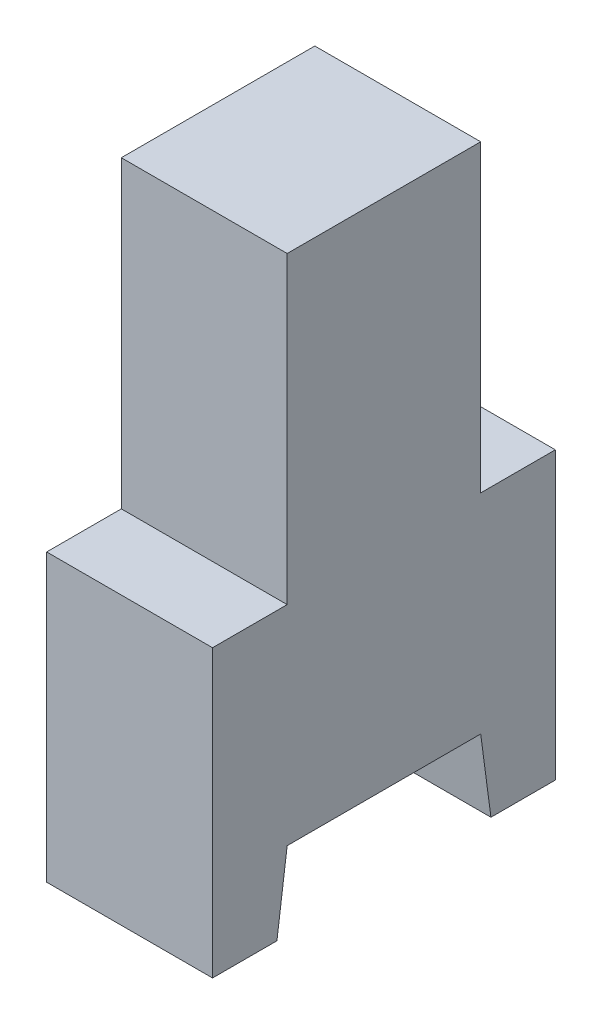
ISO-10303-21;
HEADER;
FILE_DESCRIPTION(('STEP AP214'),'2;1');
FILE_NAME('part.step','',(''),(''),'','','');
FILE_SCHEMA(('AUTOMOTIVE_DESIGN { 1 0 10303 214 1 1 1 1 }'));
ENDSEC;
DATA;
#1=APPLICATION_CONTEXT('core data for automotive mechanical design processes');
#2=APPLICATION_PROTOCOL_DEFINITION('international standard','automotive_design',2000,#1);
#3=PRODUCT_CONTEXT('',#1,'mechanical');
#4=PRODUCT('Part','Part','',(#3));
#5=PRODUCT_RELATED_PRODUCT_CATEGORY('part','',(#4));
#6=PRODUCT_DEFINITION_FORMATION('','',#4);
#7=PRODUCT_DEFINITION_CONTEXT('part definition',#1,'design');
#8=PRODUCT_DEFINITION('design','',#6,#7);
#9=PRODUCT_DEFINITION_SHAPE('','',#8);
#10=(LENGTH_UNIT() NAMED_UNIT(*) SI_UNIT(.MILLI.,.METRE.));
#11=(NAMED_UNIT(*) PLANE_ANGLE_UNIT() SI_UNIT($,.RADIAN.));
#12=(NAMED_UNIT(*) SI_UNIT($,.STERADIAN.) SOLID_ANGLE_UNIT());
#13=UNCERTAINTY_MEASURE_WITH_UNIT(LENGTH_MEASURE(1.E-05),#10,'distance_accuracy_value','');
#14=(GEOMETRIC_REPRESENTATION_CONTEXT(3) GLOBAL_UNCERTAINTY_ASSIGNED_CONTEXT((#13)) GLOBAL_UNIT_ASSIGNED_CONTEXT((#10,
#11,#12)) REPRESENTATION_CONTEXT('',''));
#15=CARTESIAN_POINT('',(0.,0.,0.));
#16=DIRECTION('',(0.,0.,1.));
#17=DIRECTION('',(1.,0.,0.));
#18=AXIS2_PLACEMENT_3D('',#15,#16,#17);
#19=CARTESIAN_POINT('',(-6.1339424186938,61.7903547962719,50.3022813378429));
#20=DIRECTION('',(0.,0.,1.));
#21=DIRECTION('',(1.,0.,0.));
#22=AXIS2_PLACEMENT_3D('',#19,#20,#21);
#23=PLANE('',#22);
#24=DIRECTION('',(0.,1.,0.));
#25=VECTOR('',#24,1.);
#26=CARTESIAN_POINT('',(-9.1339424186938,61.7903547962719,50.3022813378429));
#27=LINE('',#26,#25);
#28=CARTESIAN_POINT('',(-9.1339424186938,61.0427244153177,50.3022813378429));
#29=VERTEX_POINT('',#28);
#30=CARTESIAN_POINT('',(-9.1339424186938,66.2163547962719,50.3022813378429));
#31=VERTEX_POINT('',#30);
#32=EDGE_CURVE('E96',#29,#31,#27,.T.);
#33=ORIENTED_EDGE('',*,*,#32,.T.);
#34=DIRECTION('',(-1.,0.,0.));
#35=VECTOR('',#34,1.);
#36=CARTESIAN_POINT('',(-6.1339424186938,66.2163547962719,50.3022813378429));
#37=LINE('',#36,#35);
#38=CARTESIAN_POINT('',(-6.1339424186938,66.2163547962719,50.3022813378429));
#39=VERTEX_POINT('',#38);
#40=EDGE_CURVE('E11',#39,#31,#37,.T.);
#41=ORIENTED_EDGE('',*,*,#40,.F.);
#42=DIRECTION('',(0.,1.,0.));
#43=VECTOR('',#42,1.);
#44=CARTESIAN_POINT('',(-6.1339424186938,61.0427244153177,50.3022813378429));
#45=LINE('',#44,#43);
#46=CARTESIAN_POINT('',(-6.1339424186938,61.0427244153177,50.3022813378429));
#47=VERTEX_POINT('',#46);
#48=EDGE_CURVE('E102',#47,#39,#45,.T.);
#49=ORIENTED_EDGE('',*,*,#48,.F.);
#50=DIRECTION('',(-1.,0.,0.));
#51=VECTOR('',#50,1.);
#52=CARTESIAN_POINT('',(-6.1339424186938,61.0427244153177,50.3022813378429));
#53=LINE('',#52,#51);
#54=EDGE_CURVE('E148',#47,#29,#53,.T.);
#55=ORIENTED_EDGE('',*,*,#54,.T.);
#56=EDGE_LOOP('',(#33,#41,#49,#55));
#57=FACE_BOUND('',#56,.T.);
#58=ADVANCED_FACE('F32',(#57),#23,.F.);
#59=CARTESIAN_POINT('',(-6.1339424186938,66.2163547962719,50.3022813378429));
#60=DIRECTION('',(0.,-1.,0.));
#61=DIRECTION('',(1.,0.,0.));
#62=AXIS2_PLACEMENT_3D('',#59,#60,#61);
#63=PLANE('',#62);
#64=DIRECTION('',(0.,0.,1.));
#65=VECTOR('',#64,1.);
#66=CARTESIAN_POINT('',(-9.1339424186938,66.2163547962719,50.3022813378429));
#67=LINE('',#66,#65);
#68=CARTESIAN_POINT('',(-9.13394241869379,66.2163547962719,51.6522813378429));
#69=VERTEX_POINT('',#68);
#70=EDGE_CURVE('E153',#31,#69,#67,.T.);
#71=ORIENTED_EDGE('',*,*,#70,.T.);
#72=DIRECTION('',(-1.,0.,0.));
#73=VECTOR('',#72,1.);
#74=CARTESIAN_POINT('',(-6.13394241869379,66.2163547962719,51.6522813378429));
#75=LINE('',#74,#73);
#76=CARTESIAN_POINT('',(-6.13394241869379,66.2163547962719,51.6522813378429));
#77=VERTEX_POINT('',#76);
#78=EDGE_CURVE('E40',#77,#69,#75,.T.);
#79=ORIENTED_EDGE('',*,*,#78,.F.);
#80=DIRECTION('',(0.,0.,1.));
#81=VECTOR('',#80,1.);
#82=CARTESIAN_POINT('',(-6.1339424186938,66.2163547962719,50.3022813378429));
#83=LINE('',#82,#81);
#84=EDGE_CURVE('E242',#39,#77,#83,.T.);
#85=ORIENTED_EDGE('',*,*,#84,.F.);
#86=ORIENTED_EDGE('',*,*,#40,.T.);
#87=EDGE_LOOP('',(#71,#79,#85,#86));
#88=FACE_BOUND('',#87,.T.);
#89=ADVANCED_FACE('F245',(#88),#63,.F.);
#90=CARTESIAN_POINT('',(-6.13394241869379,71.7163547962719,51.6522813378429));
#91=DIRECTION('',(0.,0.,1.));
#92=DIRECTION('',(1.,0.,0.));
#93=AXIS2_PLACEMENT_3D('',#90,#91,#92);
#94=PLANE('',#93);
#95=DIRECTION('',(0.,1.,0.));
#96=VECTOR('',#95,1.);
#97=CARTESIAN_POINT('',(-9.13394241869379,71.7163547962719,51.6522813378429));
#98=LINE('',#97,#96);
#99=CARTESIAN_POINT('',(-9.13394241869379,71.7163547962719,51.6522813378429));
#100=VERTEX_POINT('',#99);
#101=EDGE_CURVE('E155',#69,#100,#98,.T.);
#102=ORIENTED_EDGE('',*,*,#101,.T.);
#103=DIRECTION('',(-1.,0.,0.));
#104=VECTOR('',#103,1.);
#105=CARTESIAN_POINT('',(-6.13394241869379,71.7163547962719,51.6522813378429));
#106=LINE('',#105,#104);
#107=CARTESIAN_POINT('',(-6.13394241869379,71.7163547962719,51.6522813378429));
#108=VERTEX_POINT('',#107);
#109=EDGE_CURVE('E193',#108,#100,#106,.T.);
#110=ORIENTED_EDGE('',*,*,#109,.F.);
#111=DIRECTION('',(0.,1.,0.));
#112=VECTOR('',#111,1.);
#113=CARTESIAN_POINT('',(-6.13394241869379,71.7163547962719,51.6522813378429));
#114=LINE('',#113,#112);
#115=EDGE_CURVE('E202',#77,#108,#114,.T.);
#116=ORIENTED_EDGE('',*,*,#115,.F.);
#117=ORIENTED_EDGE('',*,*,#78,.T.);
#118=EDGE_LOOP('',(#102,#110,#116,#117));
#119=FACE_BOUND('',#118,.T.);
#120=ADVANCED_FACE('F200',(#119),#94,.F.);
#121=CARTESIAN_POINT('',(-6.13394241869379,71.7163547962719,55.1522813378429));
#122=DIRECTION('',(0.,-1.,0.));
#123=DIRECTION('',(1.,0.,0.));
#124=AXIS2_PLACEMENT_3D('',#121,#122,#123);
#125=PLANE('',#124);
#126=DIRECTION('',(0.,0.,1.));
#127=VECTOR('',#126,1.);
#128=CARTESIAN_POINT('',(-9.13394241869378,71.7163547962719,55.1522813378429));
#129=LINE('',#128,#127);
#130=CARTESIAN_POINT('',(-9.13394241869378,71.7163547962719,55.1522813378429));
#131=VERTEX_POINT('',#130);
#132=EDGE_CURVE('E157',#100,#131,#129,.T.);
#133=ORIENTED_EDGE('',*,*,#132,.T.);
#134=DIRECTION('',(-1.,0.,0.));
#135=VECTOR('',#134,1.);
#136=CARTESIAN_POINT('',(-6.13394241869379,71.7163547962719,55.1522813378429));
#137=LINE('',#136,#135);
#138=CARTESIAN_POINT('',(-6.13394241869379,71.7163547962719,55.1522813378429));
#139=VERTEX_POINT('',#138);
#140=EDGE_CURVE('E190',#139,#131,#137,.T.);
#141=ORIENTED_EDGE('',*,*,#140,.F.);
#142=DIRECTION('',(0.,0.,1.));
#143=VECTOR('',#142,1.);
#144=CARTESIAN_POINT('',(-6.13394241869379,71.7163547962719,55.1522813378429));
#145=LINE('',#144,#143);
#146=EDGE_CURVE('E220',#108,#139,#145,.T.);
#147=ORIENTED_EDGE('',*,*,#146,.F.);
#148=ORIENTED_EDGE('',*,*,#109,.T.);
#149=EDGE_LOOP('',(#133,#141,#147,#148));
#150=FACE_BOUND('',#149,.T.);
#151=ADVANCED_FACE('F211',(#150),#125,.F.);
#152=CARTESIAN_POINT('',(-6.13394241869379,71.7163547962719,55.1522813378429));
#153=DIRECTION('',(0.,0.,-1.));
#154=DIRECTION('',(-1.,0.,0.));
#155=AXIS2_PLACEMENT_3D('',#152,#153,#154);
#156=PLANE('',#155);
#157=DIRECTION('',(0.,-1.,0.));
#158=VECTOR('',#157,1.);
#159=CARTESIAN_POINT('',(-9.13394241869378,71.7163547962719,55.1522813378429));
#160=LINE('',#159,#158);
#161=CARTESIAN_POINT('',(-9.13394241869379,66.2163547962719,55.1522813378429));
#162=VERTEX_POINT('',#161);
#163=EDGE_CURVE('E159',#131,#162,#160,.T.);
#164=ORIENTED_EDGE('',*,*,#163,.T.);
#165=DIRECTION('',(-1.,0.,0.));
#166=VECTOR('',#165,1.);
#167=CARTESIAN_POINT('',(-6.13394241869379,66.2163547962719,55.1522813378429));
#168=LINE('',#167,#166);
#169=CARTESIAN_POINT('',(-6.13394241869379,66.2163547962719,55.1522813378429));
#170=VERTEX_POINT('',#169);
#171=EDGE_CURVE('E187',#170,#162,#168,.T.);
#172=ORIENTED_EDGE('',*,*,#171,.F.);
#173=DIRECTION('',(0.,-1.,0.));
#174=VECTOR('',#173,1.);
#175=CARTESIAN_POINT('',(-6.13394241869379,71.7163547962719,55.1522813378429));
#176=LINE('',#175,#174);
#177=EDGE_CURVE('E217',#139,#170,#176,.T.);
#178=ORIENTED_EDGE('',*,*,#177,.F.);
#179=ORIENTED_EDGE('',*,*,#140,.T.);
#180=EDGE_LOOP('',(#164,#172,#178,#179));
#181=FACE_BOUND('',#180,.T.);
#182=ADVANCED_FACE('F215',(#181),#156,.F.);
#183=CARTESIAN_POINT('',(-6.13394241869379,66.2163547962719,55.1522813378429));
#184=DIRECTION('',(0.,-1.,0.));
#185=DIRECTION('',(1.,0.,0.));
#186=AXIS2_PLACEMENT_3D('',#183,#184,#185);
#187=PLANE('',#186);
#188=DIRECTION('',(0.,0.,1.));
#189=VECTOR('',#188,1.);
#190=CARTESIAN_POINT('',(-9.13394241869379,66.2163547962719,55.1522813378429));
#191=LINE('',#190,#189);
#192=CARTESIAN_POINT('',(-9.13394241869379,66.2163547962719,56.5022813378429));
#193=VERTEX_POINT('',#192);
#194=EDGE_CURVE('E161',#162,#193,#191,.T.);
#195=ORIENTED_EDGE('',*,*,#194,.T.);
#196=DIRECTION('',(-1.,0.,0.));
#197=VECTOR('',#196,1.);
#198=CARTESIAN_POINT('',(-6.13394241869379,66.2163547962719,56.5022813378429));
#199=LINE('',#198,#197);
#200=CARTESIAN_POINT('',(-6.13394241869379,66.2163547962719,56.5022813378429));
#201=VERTEX_POINT('',#200);
#202=EDGE_CURVE('E184',#201,#193,#199,.T.);
#203=ORIENTED_EDGE('',*,*,#202,.F.);
#204=DIRECTION('',(0.,0.,1.));
#205=VECTOR('',#204,1.);
#206=CARTESIAN_POINT('',(-6.13394241869379,66.2163547962719,55.1522813378429));
#207=LINE('',#206,#205);
#208=EDGE_CURVE('E219',#170,#201,#207,.T.);
#209=ORIENTED_EDGE('',*,*,#208,.F.);
#210=ORIENTED_EDGE('',*,*,#171,.T.);
#211=EDGE_LOOP('',(#195,#203,#209,#210));
#212=FACE_BOUND('',#211,.T.);
#213=ADVANCED_FACE('F257',(#212),#187,.F.);
#214=CARTESIAN_POINT('',(-6.13394241869379,61.7903547962719,56.5022813378429));
#215=DIRECTION('',(0.,0.,-1.));
#216=DIRECTION('',(-1.,0.,0.));
#217=AXIS2_PLACEMENT_3D('',#214,#215,#216);
#218=PLANE('',#217);
#219=DIRECTION('',(0.,-1.,0.));
#220=VECTOR('',#219,1.);
#221=CARTESIAN_POINT('',(-9.13394241869379,61.7903547962719,56.5022813378429));
#222=LINE('',#221,#220);
#223=CARTESIAN_POINT('',(-9.13394241869379,61.0427244153177,56.5022813378429));
#224=VERTEX_POINT('',#223);
#225=EDGE_CURVE('E164',#193,#224,#222,.T.);
#226=ORIENTED_EDGE('',*,*,#225,.T.);
#227=DIRECTION('',(-1.,0.,0.));
#228=VECTOR('',#227,1.);
#229=CARTESIAN_POINT('',(-6.13394241869379,61.0427244153177,56.5022813378429));
#230=LINE('',#229,#228);
#231=CARTESIAN_POINT('',(-6.13394241869379,61.0427244153177,56.5022813378429));
#232=VERTEX_POINT('',#231);
#233=EDGE_CURVE('E181',#232,#224,#230,.T.);
#234=ORIENTED_EDGE('',*,*,#233,.F.);
#235=DIRECTION('',(0.,-1.,0.));
#236=VECTOR('',#235,1.);
#237=CARTESIAN_POINT('',(-6.13394241869379,66.2163547962719,56.5022813378429));
#238=LINE('',#237,#236);
#239=EDGE_CURVE('E222',#201,#232,#238,.T.);
#240=ORIENTED_EDGE('',*,*,#239,.F.);
#241=ORIENTED_EDGE('',*,*,#202,.T.);
#242=EDGE_LOOP('',(#226,#234,#240,#241));
#243=FACE_BOUND('',#242,.T.);
#244=ADVANCED_FACE('F260',(#243),#218,.F.);
#245=CARTESIAN_POINT('',(-6.13394241869379,61.0427244153177,56.5022813378429));
#246=DIRECTION('',(0.,1.,0.));
#247=DIRECTION('',(0.,0.,1.));
#248=AXIS2_PLACEMENT_3D('',#245,#246,#247);
#249=PLANE('',#248);
#250=DIRECTION('',(0.,0.,-1.));
#251=VECTOR('',#250,1.);
#252=CARTESIAN_POINT('',(-9.13394241869379,61.0427244153177,56.5022813378429));
#253=LINE('',#252,#251);
#254=CARTESIAN_POINT('',(-9.1339424186938,61.0427244153177,55.3375831353595));
#255=VERTEX_POINT('',#254);
#256=EDGE_CURVE('E166',#224,#255,#253,.T.);
#257=ORIENTED_EDGE('',*,*,#256,.T.);
#258=DIRECTION('',(-1.,0.,0.));
#259=VECTOR('',#258,1.);
#260=CARTESIAN_POINT('',(-6.1339424186938,61.0427244153177,55.3375831353595));
#261=LINE('',#260,#259);
#262=CARTESIAN_POINT('',(-6.1339424186938,61.0427244153177,55.3375831353595));
#263=VERTEX_POINT('',#262);
#264=EDGE_CURVE('E178',#263,#255,#261,.T.);
#265=ORIENTED_EDGE('',*,*,#264,.F.);
#266=DIRECTION('',(0.,0.,-1.));
#267=VECTOR('',#266,1.);
#268=CARTESIAN_POINT('',(-6.13394241869379,61.0427244153177,56.5022813378429));
#269=LINE('',#268,#267);
#270=EDGE_CURVE('E228',#232,#263,#269,.T.);
#271=ORIENTED_EDGE('',*,*,#270,.F.);
#272=ORIENTED_EDGE('',*,*,#233,.T.);
#273=EDGE_LOOP('',(#257,#265,#271,#272));
#274=FACE_BOUND('',#273,.T.);
#275=ADVANCED_FACE('F234',(#274),#249,.F.);
#276=CARTESIAN_POINT('',(-6.1339424186938,61.0427244153177,55.3375831353595));
#277=DIRECTION('',(0.,0.131432691271418,0.991325096860335));
#278=DIRECTION('',(0.,-0.991325096860335,0.131432691271418));
#279=AXIS2_PLACEMENT_3D('',#276,#277,#278);
#280=PLANE('',#279);
#281=DIRECTION('',(0.,0.991325096860335,-0.131432691271418));
#282=VECTOR('',#281,1.);
#283=CARTESIAN_POINT('',(-9.1339424186938,61.0427244153177,55.3375831353595));
#284=LINE('',#283,#282);
#285=CARTESIAN_POINT('',(-9.13394241869379,62.4403547962719,55.1522813378429));
#286=VERTEX_POINT('',#285);
#287=EDGE_CURVE('E168',#255,#286,#284,.T.);
#288=ORIENTED_EDGE('',*,*,#287,.T.);
#289=DIRECTION('',(-1.,0.,0.));
#290=VECTOR('',#289,1.);
#291=CARTESIAN_POINT('',(-6.13394241869379,62.4403547962719,55.1522813378429));
#292=LINE('',#291,#290);
#293=CARTESIAN_POINT('',(-6.13394241869379,62.4403547962719,55.1522813378429));
#294=VERTEX_POINT('',#293);
#295=EDGE_CURVE('E143',#294,#286,#292,.T.);
#296=ORIENTED_EDGE('',*,*,#295,.F.);
#297=DIRECTION('',(0.,0.991325096860335,-0.131432691271418));
#298=VECTOR('',#297,1.);
#299=CARTESIAN_POINT('',(-6.1339424186938,61.0427244153177,55.3375831353595));
#300=LINE('',#299,#298);
#301=EDGE_CURVE('E134',#263,#294,#300,.T.);
#302=ORIENTED_EDGE('',*,*,#301,.F.);
#303=ORIENTED_EDGE('',*,*,#264,.T.);
#304=EDGE_LOOP('',(#288,#296,#302,#303));
#305=FACE_BOUND('',#304,.T.);
#306=ADVANCED_FACE('F238',(#305),#280,.F.);
#307=CARTESIAN_POINT('',(-6.13394241869379,62.4403547962719,55.1522813378429));
#308=DIRECTION('',(0.,1.,0.));
#309=DIRECTION('',(-1.,0.,0.));
#310=AXIS2_PLACEMENT_3D('',#307,#308,#309);
#311=PLANE('',#310);
#312=DIRECTION('',(0.,0.,-1.));
#313=VECTOR('',#312,1.);
#314=CARTESIAN_POINT('',(-9.13394241869379,62.4403547962719,55.1522813378429));
#315=LINE('',#314,#313);
#316=CARTESIAN_POINT('',(-9.1339424186938,62.4403547962719,51.6522813378429));
#317=VERTEX_POINT('',#316);
#318=EDGE_CURVE('E142',#286,#317,#315,.T.);
#319=ORIENTED_EDGE('',*,*,#318,.T.);
#320=DIRECTION('',(-1.,0.,0.));
#321=VECTOR('',#320,1.);
#322=CARTESIAN_POINT('',(-6.1339424186938,62.4403547962719,51.6522813378429));
#323=LINE('',#322,#321);
#324=CARTESIAN_POINT('',(-6.1339424186938,62.4403547962719,51.6522813378429));
#325=VERTEX_POINT('',#324);
#326=EDGE_CURVE('E139',#325,#317,#323,.T.);
#327=ORIENTED_EDGE('',*,*,#326,.F.);
#328=DIRECTION('',(0.,0.,-1.));
#329=VECTOR('',#328,1.);
#330=CARTESIAN_POINT('',(-6.13394241869379,62.4403547962719,55.1522813378429));
#331=LINE('',#330,#329);
#332=EDGE_CURVE('E128',#294,#325,#331,.T.);
#333=ORIENTED_EDGE('',*,*,#332,.F.);
#334=ORIENTED_EDGE('',*,*,#295,.T.);
#335=EDGE_LOOP('',(#319,#327,#333,#334));
#336=FACE_BOUND('',#335,.T.);
#337=ADVANCED_FACE('F140',(#336),#311,.F.);
#338=CARTESIAN_POINT('',(-6.1339424186938,62.4403547962719,51.6522813378429));
#339=DIRECTION('',(0.,0.131432691271419,-0.991325096860335));
#340=DIRECTION('',(0.,0.991325096860335,0.131432691271419));
#341=AXIS2_PLACEMENT_3D('',#338,#339,#340);
#342=PLANE('',#341);
#343=DIRECTION('',(0.,-0.991325096860335,-0.131432691271419));
#344=VECTOR('',#343,1.);
#345=CARTESIAN_POINT('',(-9.1339424186938,62.4403547962719,51.6522813378429));
#346=LINE('',#345,#344);
#347=CARTESIAN_POINT('',(-9.1339424186938,61.0427244153177,51.4669795403263));
#348=VERTEX_POINT('',#347);
#349=EDGE_CURVE('E89',#317,#348,#346,.T.);
#350=ORIENTED_EDGE('',*,*,#349,.T.);
#351=DIRECTION('',(-1.,0.,0.));
#352=VECTOR('',#351,1.);
#353=CARTESIAN_POINT('',(-6.1339424186938,61.0427244153177,51.4669795403263));
#354=LINE('',#353,#352);
#355=CARTESIAN_POINT('',(-6.1339424186938,61.0427244153177,51.4669795403263));
#356=VERTEX_POINT('',#355);
#357=EDGE_CURVE('E144',#356,#348,#354,.T.);
#358=ORIENTED_EDGE('',*,*,#357,.F.);
#359=DIRECTION('',(0.,-0.991325096860335,-0.131432691271419));
#360=VECTOR('',#359,1.);
#361=CARTESIAN_POINT('',(-6.1339424186938,62.4403547962719,51.6522813378429));
#362=LINE('',#361,#360);
#363=EDGE_CURVE('E132',#325,#356,#362,.T.);
#364=ORIENTED_EDGE('',*,*,#363,.F.);
#365=ORIENTED_EDGE('',*,*,#326,.T.);
#366=EDGE_LOOP('',(#350,#358,#364,#365));
#367=FACE_BOUND('',#366,.T.);
#368=ADVANCED_FACE('F146',(#367),#342,.F.);
#369=CARTESIAN_POINT('',(-6.1339424186938,61.0427244153177,51.4669795403263));
#370=DIRECTION('',(0.,1.,0.));
#371=DIRECTION('',(-1.,0.,0.));
#372=AXIS2_PLACEMENT_3D('',#369,#370,#371);
#373=PLANE('',#372);
#374=DIRECTION('',(0.,0.,-1.));
#375=VECTOR('',#374,1.);
#376=CARTESIAN_POINT('',(-9.1339424186938,61.0427244153177,51.4669795403263));
#377=LINE('',#376,#375);
#378=EDGE_CURVE('E172',#348,#29,#377,.T.);
#379=ORIENTED_EDGE('',*,*,#378,.T.);
#380=ORIENTED_EDGE('',*,*,#54,.F.);
#381=DIRECTION('',(0.,0.,-1.));
#382=VECTOR('',#381,1.);
#383=CARTESIAN_POINT('',(-6.1339424186938,61.0427244153177,51.4669795403263));
#384=LINE('',#383,#382);
#385=EDGE_CURVE('E48',#356,#47,#384,.T.);
#386=ORIENTED_EDGE('',*,*,#385,.F.);
#387=ORIENTED_EDGE('',*,*,#357,.T.);
#388=EDGE_LOOP('',(#379,#380,#386,#387));
#389=FACE_BOUND('',#388,.T.);
#390=ADVANCED_FACE('F240',(#389),#373,.F.);
#391=CARTESIAN_POINT('',(-6.1339424186939,0.,0.));
#392=DIRECTION('',(1.,0.,0.));
#393=DIRECTION('',(0.,1.,0.));
#394=AXIS2_PLACEMENT_3D('',#391,#392,#393);
#395=PLANE('',#394);
#396=ORIENTED_EDGE('',*,*,#48,.T.);
#397=ORIENTED_EDGE('',*,*,#84,.T.);
#398=ORIENTED_EDGE('',*,*,#115,.T.);
#399=ORIENTED_EDGE('',*,*,#146,.T.);
#400=ORIENTED_EDGE('',*,*,#177,.T.);
#401=ORIENTED_EDGE('',*,*,#208,.T.);
#402=ORIENTED_EDGE('',*,*,#239,.T.);
#403=ORIENTED_EDGE('',*,*,#270,.T.);
#404=ORIENTED_EDGE('',*,*,#301,.T.);
#405=ORIENTED_EDGE('',*,*,#332,.T.);
#406=ORIENTED_EDGE('',*,*,#363,.T.);
#407=ORIENTED_EDGE('',*,*,#385,.T.);
#408=EDGE_LOOP('',(#396,#397,#398,#399,#400,#401,#402,#403,#404,#405,#406,#407));
#409=FACE_BOUND('',#408,.T.);
#410=ADVANCED_FACE('F130',(#409),#395,.T.);
#411=CARTESIAN_POINT('',(-9.13394241869391,0.,0.));
#412=DIRECTION('',(1.,0.,0.));
#413=DIRECTION('',(0.,1.,0.));
#414=AXIS2_PLACEMENT_3D('',#411,#412,#413);
#415=PLANE('',#414);
#416=ORIENTED_EDGE('',*,*,#32,.F.);
#417=ORIENTED_EDGE('',*,*,#378,.F.);
#418=ORIENTED_EDGE('',*,*,#349,.F.);
#419=ORIENTED_EDGE('',*,*,#318,.F.);
#420=ORIENTED_EDGE('',*,*,#287,.F.);
#421=ORIENTED_EDGE('',*,*,#256,.F.);
#422=ORIENTED_EDGE('',*,*,#225,.F.);
#423=ORIENTED_EDGE('',*,*,#194,.F.);
#424=ORIENTED_EDGE('',*,*,#163,.F.);
#425=ORIENTED_EDGE('',*,*,#132,.F.);
#426=ORIENTED_EDGE('',*,*,#101,.F.);
#427=ORIENTED_EDGE('',*,*,#70,.F.);
#428=EDGE_LOOP('',(#416,#417,#418,#419,#420,#421,#422,#423,#424,#425,#426,#427));
#429=FACE_BOUND('',#428,.T.);
#430=ADVANCED_FACE('F206',(#429),#415,.F.);
#431=CLOSED_SHELL('',(#58,#89,#120,#151,#182,#213,#244,#275,#306,#337,#368,#390,#410,#430));
#432=MANIFOLD_SOLID_BREP('B2',#431);
#433=ADVANCED_BREP_SHAPE_REPRESENTATION('',(#18,#432),#14);
#434=SHAPE_DEFINITION_REPRESENTATION(#9,#433);
ENDSEC;
END-ISO-10303-21;
